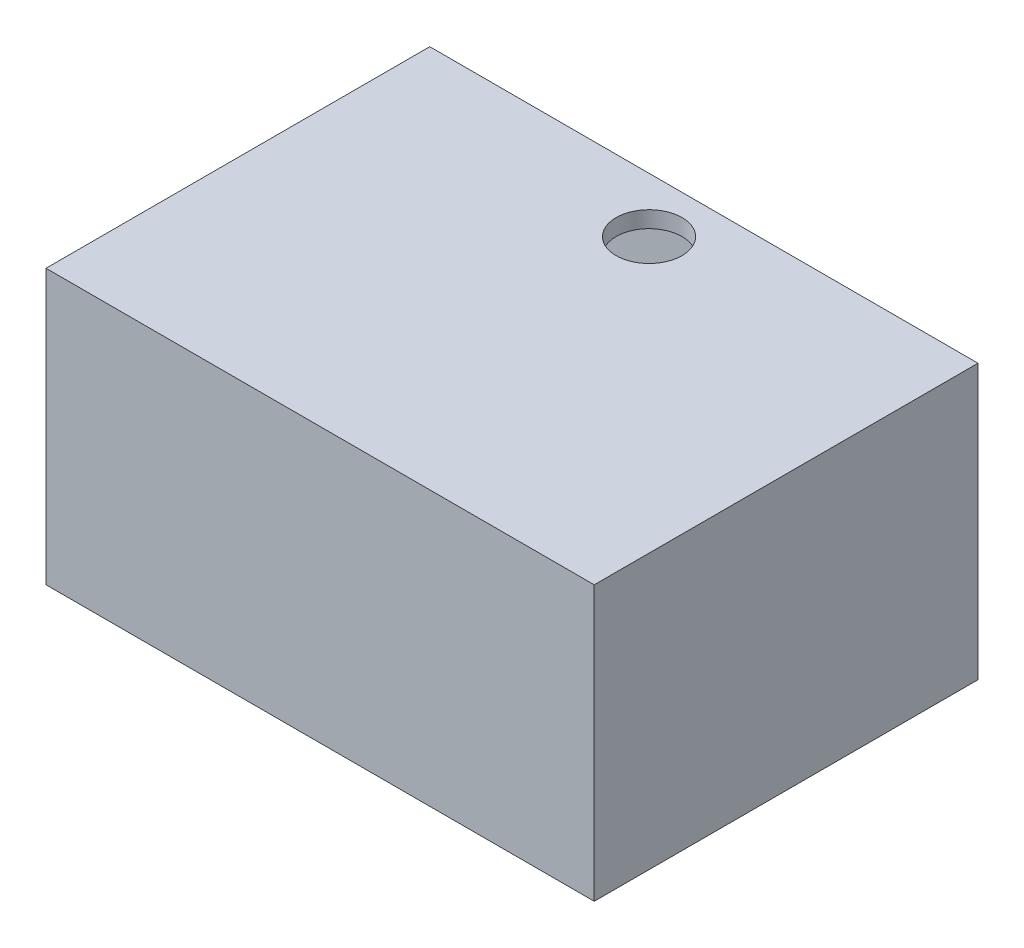
ISO-10303-21;
HEADER;
FILE_DESCRIPTION(('STEP AP214'),'2;1');
FILE_NAME('part.step','',(''),(''),'','','');
FILE_SCHEMA(('AUTOMOTIVE_DESIGN { 1 0 10303 214 1 1 1 1 }'));
ENDSEC;
DATA;
#1=APPLICATION_CONTEXT('core data for automotive mechanical design processes');
#2=APPLICATION_PROTOCOL_DEFINITION('international standard','automotive_design',2000,#1);
#3=PRODUCT_CONTEXT('',#1,'mechanical');
#4=PRODUCT('Part','Part','',(#3));
#5=PRODUCT_RELATED_PRODUCT_CATEGORY('part','',(#4));
#6=PRODUCT_DEFINITION_FORMATION('','',#4);
#7=PRODUCT_DEFINITION_CONTEXT('part definition',#1,'design');
#8=PRODUCT_DEFINITION('design','',#6,#7);
#9=PRODUCT_DEFINITION_SHAPE('','',#8);
#10=(LENGTH_UNIT() NAMED_UNIT(*) SI_UNIT(.MILLI.,.METRE.));
#11=(NAMED_UNIT(*) PLANE_ANGLE_UNIT() SI_UNIT($,.RADIAN.));
#12=(NAMED_UNIT(*) SI_UNIT($,.STERADIAN.) SOLID_ANGLE_UNIT());
#13=UNCERTAINTY_MEASURE_WITH_UNIT(LENGTH_MEASURE(1.E-05),#10,'distance_accuracy_value','');
#14=(GEOMETRIC_REPRESENTATION_CONTEXT(3) GLOBAL_UNCERTAINTY_ASSIGNED_CONTEXT((#13)) GLOBAL_UNIT_ASSIGNED_CONTEXT((#10,
#11,#12)) REPRESENTATION_CONTEXT('',''));
#15=CARTESIAN_POINT('',(0.,0.,0.));
#16=DIRECTION('',(0.,0.,1.));
#17=DIRECTION('',(1.,0.,0.));
#18=AXIS2_PLACEMENT_3D('',#15,#16,#17);
#19=CARTESIAN_POINT('',(-50.,-22.,-70.));
#20=DIRECTION('',(0.,1.,0.));
#21=DIRECTION('',(0.,0.,-1.));
#22=AXIS2_PLACEMENT_3D('',#19,#20,#21);
#23=PLANE('',#22);
#24=DIRECTION('',(1.,0.,0.));
#25=VECTOR('',#24,1.);
#26=CARTESIAN_POINT('',(-50.,-22.,-3.));
#27=LINE('',#26,#25);
#28=CARTESIAN_POINT('',(-47.,-22.,-3.));
#29=VERTEX_POINT('',#28);
#30=CARTESIAN_POINT('',(47.,-22.,-3.));
#31=VERTEX_POINT('',#30);
#32=EDGE_CURVE('E139',#29,#31,#27,.T.);
#33=ORIENTED_EDGE('',*,*,#32,.T.);
#34=DIRECTION('',(0.,0.,1.));
#35=VECTOR('',#34,1.);
#36=CARTESIAN_POINT('',(47.,-22.,-70.));
#37=LINE('',#36,#35);
#38=CARTESIAN_POINT('',(47.,-22.,-67.));
#39=VERTEX_POINT('',#38);
#40=EDGE_CURVE('E140',#39,#31,#37,.T.);
#41=ORIENTED_EDGE('',*,*,#40,.F.);
#42=DIRECTION('',(1.,0.,0.));
#43=VECTOR('',#42,1.);
#44=CARTESIAN_POINT('',(-50.,-22.,-67.));
#45=LINE('',#44,#43);
#46=CARTESIAN_POINT('',(-47.,-22.,-67.));
#47=VERTEX_POINT('',#46);
#48=EDGE_CURVE('E124',#47,#39,#45,.T.);
#49=ORIENTED_EDGE('',*,*,#48,.F.);
#50=DIRECTION('',(0.,0.,1.));
#51=VECTOR('',#50,1.);
#52=CARTESIAN_POINT('',(-47.,-22.,-70.));
#53=LINE('',#52,#51);
#54=EDGE_CURVE('E120',#47,#29,#53,.T.);
#55=ORIENTED_EDGE('',*,*,#54,.T.);
#56=EDGE_LOOP('',(#33,#41,#49,#55));
#57=FACE_BOUND('',#56,.T.);
#58=ADVANCED_FACE('F37',(#57),#23,.T.);
#59=CARTESIAN_POINT('',(0.,0.,-67.));
#60=DIRECTION('',(0.,0.,-1.));
#61=DIRECTION('',(1.,0.,0.));
#62=AXIS2_PLACEMENT_3D('',#59,#60,#61);
#63=PLANE('',#62);
#64=CARTESIAN_POINT('',(-9.44,-11.95,-67.));
#65=DIRECTION('',(0.,0.,1.));
#66=DIRECTION('',(1.,0.,0.));
#67=AXIS2_PLACEMENT_3D('',#64,#65,#66);
#68=CIRCLE('',#67,7.5);
#69=CARTESIAN_POINT('',(-1.94,-11.95,-67.));
#70=VERTEX_POINT('',#69);
#71=EDGE_CURVE('E316',#70,#70,#68,.T.);
#72=ORIENTED_EDGE('',*,*,#71,.F.);
#73=EDGE_LOOP('',(#72));
#74=FACE_BOUND('',#73,.T.);
#75=DIRECTION('',(-1.,0.,0.));
#76=VECTOR('',#75,1.);
#77=CARTESIAN_POINT('',(50.,22.,-67.));
#78=LINE('',#77,#76);
#79=CARTESIAN_POINT('',(47.,22.,-67.));
#80=VERTEX_POINT('',#79);
#81=CARTESIAN_POINT('',(-47.,22.,-67.));
#82=VERTEX_POINT('',#81);
#83=EDGE_CURVE('E112',#80,#82,#78,.T.);
#84=ORIENTED_EDGE('',*,*,#83,.T.);
#85=DIRECTION('',(0.,-1.,0.));
#86=VECTOR('',#85,1.);
#87=CARTESIAN_POINT('',(-47.,25.,-67.));
#88=LINE('',#87,#86);
#89=EDGE_CURVE('E117',#82,#47,#88,.T.);
#90=ORIENTED_EDGE('',*,*,#89,.T.);
#91=ORIENTED_EDGE('',*,*,#48,.T.);
#92=DIRECTION('',(0.,1.,0.));
#93=VECTOR('',#92,1.);
#94=CARTESIAN_POINT('',(47.,25.,-67.));
#95=LINE('',#94,#93);
#96=EDGE_CURVE('E125',#39,#80,#95,.T.);
#97=ORIENTED_EDGE('',*,*,#96,.T.);
#98=EDGE_LOOP('',(#84,#90,#91,#97));
#99=FACE_BOUND('',#98,.T.);
#100=ADVANCED_FACE('F128',(#74,#99),#63,.F.);
#101=CARTESIAN_POINT('',(0.,0.,-3.));
#102=DIRECTION('',(0.,0.,-1.));
#103=DIRECTION('',(1.,0.,0.));
#104=AXIS2_PLACEMENT_3D('',#101,#102,#103);
#105=PLANE('',#104);
#106=DIRECTION('',(0.,1.,0.));
#107=VECTOR('',#106,1.);
#108=CARTESIAN_POINT('',(47.,25.,-3.));
#109=LINE('',#108,#107);
#110=CARTESIAN_POINT('',(47.,22.,-3.));
#111=VERTEX_POINT('',#110);
#112=EDGE_CURVE('E131',#31,#111,#109,.T.);
#113=ORIENTED_EDGE('',*,*,#112,.F.);
#114=ORIENTED_EDGE('',*,*,#32,.F.);
#115=DIRECTION('',(0.,-1.,0.));
#116=VECTOR('',#115,1.);
#117=CARTESIAN_POINT('',(-47.,25.,-3.));
#118=LINE('',#117,#116);
#119=CARTESIAN_POINT('',(-47.,22.,-3.));
#120=VERTEX_POINT('',#119);
#121=EDGE_CURVE('E137',#120,#29,#118,.T.);
#122=ORIENTED_EDGE('',*,*,#121,.F.);
#123=DIRECTION('',(-1.,0.,0.));
#124=VECTOR('',#123,1.);
#125=CARTESIAN_POINT('',(0.,22.,-3.));
#126=LINE('',#125,#124);
#127=EDGE_CURVE('E11',#111,#120,#126,.T.);
#128=ORIENTED_EDGE('',*,*,#127,.F.);
#129=EDGE_LOOP('',(#113,#114,#122,#128));
#130=FACE_BOUND('',#129,.T.);
#131=ADVANCED_FACE('F199',(#130),#105,.T.);
#132=CARTESIAN_POINT('',(-47.,25.,-70.));
#133=DIRECTION('',(1.,0.,0.));
#134=DIRECTION('',(0.,1.,0.));
#135=AXIS2_PLACEMENT_3D('',#132,#133,#134);
#136=PLANE('',#135);
#137=ORIENTED_EDGE('',*,*,#121,.T.);
#138=ORIENTED_EDGE('',*,*,#54,.F.);
#139=ORIENTED_EDGE('',*,*,#89,.F.);
#140=DIRECTION('',(0.,0.,1.));
#141=VECTOR('',#140,1.);
#142=CARTESIAN_POINT('',(-47.,22.,-67.));
#143=LINE('',#142,#141);
#144=EDGE_CURVE('E53',#82,#120,#143,.T.);
#145=ORIENTED_EDGE('',*,*,#144,.T.);
#146=EDGE_LOOP('',(#137,#138,#139,#145));
#147=FACE_BOUND('',#146,.T.);
#148=ADVANCED_FACE('F118',(#147),#136,.T.);
#149=CARTESIAN_POINT('',(47.,25.,-70.));
#150=DIRECTION('',(-1.,0.,0.));
#151=DIRECTION('',(0.,-1.,0.));
#152=AXIS2_PLACEMENT_3D('',#149,#150,#151);
#153=PLANE('',#152);
#154=ORIENTED_EDGE('',*,*,#96,.F.);
#155=ORIENTED_EDGE('',*,*,#40,.T.);
#156=ORIENTED_EDGE('',*,*,#112,.T.);
#157=DIRECTION('',(0.,0.,1.));
#158=VECTOR('',#157,1.);
#159=CARTESIAN_POINT('',(47.,22.,-70.));
#160=LINE('',#159,#158);
#161=EDGE_CURVE('E129',#80,#111,#160,.T.);
#162=ORIENTED_EDGE('',*,*,#161,.F.);
#163=EDGE_LOOP('',(#154,#155,#156,#162));
#164=FACE_BOUND('',#163,.T.);
#165=ADVANCED_FACE('F224',(#164),#153,.T.);
#166=CARTESIAN_POINT('',(50.,22.,-67.));
#167=DIRECTION('',(0.,1.,0.));
#168=DIRECTION('',(-1.,0.,0.));
#169=AXIS2_PLACEMENT_3D('',#166,#167,#168);
#170=PLANE('',#169);
#171=CARTESIAN_POINT('',(0.,22.,-60.));
#172=DIRECTION('',(0.,-1.,0.));
#173=DIRECTION('',(-1.,0.,0.));
#174=AXIS2_PLACEMENT_3D('',#171,#172,#173);
#175=CIRCLE('',#174,6.015);
#176=CARTESIAN_POINT('',(-6.015,22.,-60.));
#177=VERTEX_POINT('',#176);
#178=EDGE_CURVE('E41',#177,#177,#175,.T.);
#179=ORIENTED_EDGE('',*,*,#178,.F.);
#180=EDGE_LOOP('',(#179));
#181=FACE_BOUND('',#180,.T.);
#182=ORIENTED_EDGE('',*,*,#161,.T.);
#183=ORIENTED_EDGE('',*,*,#127,.T.);
#184=ORIENTED_EDGE('',*,*,#144,.F.);
#185=ORIENTED_EDGE('',*,*,#83,.F.);
#186=EDGE_LOOP('',(#182,#183,#184,#185));
#187=FACE_BOUND('',#186,.T.);
#188=ADVANCED_FACE('F110',(#181,#187),#170,.F.);
#189=CARTESIAN_POINT('',(0.,20.,-60.));
#190=DIRECTION('',(0.,1.,0.));
#191=DIRECTION('',(0.,0.,-1.));
#192=AXIS2_PLACEMENT_3D('',#189,#190,#191);
#193=CYLINDRICAL_SURFACE('',#192,6.015);
#194=CARTESIAN_POINT('',(0.,25.,-60.));
#195=DIRECTION('',(0.,-1.,0.));
#196=DIRECTION('',(0.,0.,-1.));
#197=AXIS2_PLACEMENT_3D('',#194,#195,#196);
#198=CIRCLE('',#197,6.015);
#199=CARTESIAN_POINT('',(0.,25.,-66.015));
#200=VERTEX_POINT('',#199);
#201=EDGE_CURVE('E315',#200,#200,#198,.T.);
#202=ORIENTED_EDGE('',*,*,#201,.F.);
#203=EDGE_LOOP('',(#202));
#204=FACE_BOUND('',#203,.T.);
#205=ORIENTED_EDGE('',*,*,#178,.T.);
#206=EDGE_LOOP('',(#205));
#207=FACE_BOUND('',#206,.T.);
#208=ADVANCED_FACE('F219',(#204,#207),#193,.F.);
#209=CARTESIAN_POINT('',(-50.,25.,-70.));
#210=DIRECTION('',(0.,-1.,0.));
#211=DIRECTION('',(0.,0.,1.));
#212=AXIS2_PLACEMENT_3D('',#209,#210,#211);
#213=PLANE('',#212);
#214=ORIENTED_EDGE('',*,*,#201,.T.);
#215=EDGE_LOOP('',(#214));
#216=FACE_BOUND('',#215,.T.);
#217=DIRECTION('',(0.,0.,1.));
#218=VECTOR('',#217,1.);
#219=CARTESIAN_POINT('',(50.,25.,-70.));
#220=LINE('',#219,#218);
#221=CARTESIAN_POINT('',(50.,25.,-70.));
#222=VERTEX_POINT('',#221);
#223=CARTESIAN_POINT('',(50.,25.,0.));
#224=VERTEX_POINT('',#223);
#225=EDGE_CURVE('E46',#222,#224,#220,.T.);
#226=ORIENTED_EDGE('',*,*,#225,.F.);
#227=DIRECTION('',(-1.,0.,0.));
#228=VECTOR('',#227,1.);
#229=CARTESIAN_POINT('',(-50.,25.,-70.));
#230=LINE('',#229,#228);
#231=CARTESIAN_POINT('',(-50.,25.,-70.));
#232=VERTEX_POINT('',#231);
#233=EDGE_CURVE('E150',#222,#232,#230,.T.);
#234=ORIENTED_EDGE('',*,*,#233,.T.);
#235=DIRECTION('',(0.,0.,1.));
#236=VECTOR('',#235,1.);
#237=CARTESIAN_POINT('',(-50.,25.,-70.));
#238=LINE('',#237,#236);
#239=CARTESIAN_POINT('',(-50.,25.,0.));
#240=VERTEX_POINT('',#239);
#241=EDGE_CURVE('E169',#232,#240,#238,.T.);
#242=ORIENTED_EDGE('',*,*,#241,.T.);
#243=DIRECTION('',(-1.,0.,0.));
#244=VECTOR('',#243,1.);
#245=CARTESIAN_POINT('',(-50.,25.,0.));
#246=LINE('',#245,#244);
#247=EDGE_CURVE('E159',#224,#240,#246,.T.);
#248=ORIENTED_EDGE('',*,*,#247,.F.);
#249=EDGE_LOOP('',(#226,#234,#242,#248));
#250=FACE_BOUND('',#249,.T.);
#251=ADVANCED_FACE('F176',(#216,#250),#213,.F.);
#252=CARTESIAN_POINT('',(50.,25.,-70.));
#253=DIRECTION('',(-1.,0.,0.));
#254=DIRECTION('',(0.,-1.,0.));
#255=AXIS2_PLACEMENT_3D('',#252,#253,#254);
#256=PLANE('',#255);
#257=DIRECTION('',(0.,1.,0.));
#258=VECTOR('',#257,1.);
#259=CARTESIAN_POINT('',(50.,25.,0.));
#260=LINE('',#259,#258);
#261=CARTESIAN_POINT('',(50.,-25.,0.));
#262=VERTEX_POINT('',#261);
#263=EDGE_CURVE('E147',#262,#224,#260,.T.);
#264=ORIENTED_EDGE('',*,*,#263,.F.);
#265=DIRECTION('',(0.,0.,1.));
#266=VECTOR('',#265,1.);
#267=CARTESIAN_POINT('',(50.,-25.,-70.));
#268=LINE('',#267,#266);
#269=CARTESIAN_POINT('',(50.,-25.,-70.));
#270=VERTEX_POINT('',#269);
#271=EDGE_CURVE('E157',#270,#262,#268,.T.);
#272=ORIENTED_EDGE('',*,*,#271,.F.);
#273=DIRECTION('',(0.,1.,0.));
#274=VECTOR('',#273,1.);
#275=CARTESIAN_POINT('',(50.,25.,-70.));
#276=LINE('',#275,#274);
#277=EDGE_CURVE('E87',#270,#222,#276,.T.);
#278=ORIENTED_EDGE('',*,*,#277,.T.);
#279=ORIENTED_EDGE('',*,*,#225,.T.);
#280=EDGE_LOOP('',(#264,#272,#278,#279));
#281=FACE_BOUND('',#280,.T.);
#282=ADVANCED_FACE('F39',(#281),#256,.F.);
#283=CARTESIAN_POINT('',(-50.,25.,-70.));
#284=DIRECTION('',(1.,0.,0.));
#285=DIRECTION('',(0.,1.,0.));
#286=AXIS2_PLACEMENT_3D('',#283,#284,#285);
#287=PLANE('',#286);
#288=DIRECTION('',(0.,-1.,0.));
#289=VECTOR('',#288,1.);
#290=CARTESIAN_POINT('',(-50.,25.,0.));
#291=LINE('',#290,#289);
#292=CARTESIAN_POINT('',(-50.,-25.,0.));
#293=VERTEX_POINT('',#292);
#294=EDGE_CURVE('E162',#240,#293,#291,.T.);
#295=ORIENTED_EDGE('',*,*,#294,.F.);
#296=ORIENTED_EDGE('',*,*,#241,.F.);
#297=DIRECTION('',(0.,-1.,0.));
#298=VECTOR('',#297,1.);
#299=CARTESIAN_POINT('',(-50.,25.,-70.));
#300=LINE('',#299,#298);
#301=CARTESIAN_POINT('',(-50.,-25.,-70.));
#302=VERTEX_POINT('',#301);
#303=EDGE_CURVE('E153',#232,#302,#300,.T.);
#304=ORIENTED_EDGE('',*,*,#303,.T.);
#305=DIRECTION('',(0.,0.,1.));
#306=VECTOR('',#305,1.);
#307=CARTESIAN_POINT('',(-50.,-25.,-70.));
#308=LINE('',#307,#306);
#309=EDGE_CURVE('E166',#302,#293,#308,.T.);
#310=ORIENTED_EDGE('',*,*,#309,.T.);
#311=EDGE_LOOP('',(#295,#296,#304,#310));
#312=FACE_BOUND('',#311,.T.);
#313=ADVANCED_FACE('F180',(#312),#287,.F.);
#314=CARTESIAN_POINT('',(-50.,-25.,-70.));
#315=DIRECTION('',(0.,1.,0.));
#316=DIRECTION('',(0.,0.,-1.));
#317=AXIS2_PLACEMENT_3D('',#314,#315,#316);
#318=PLANE('',#317);
#319=DIRECTION('',(1.,0.,0.));
#320=VECTOR('',#319,1.);
#321=CARTESIAN_POINT('',(-50.,-25.,0.));
#322=LINE('',#321,#320);
#323=EDGE_CURVE('E81',#293,#262,#322,.T.);
#324=ORIENTED_EDGE('',*,*,#323,.F.);
#325=ORIENTED_EDGE('',*,*,#309,.F.);
#326=DIRECTION('',(1.,0.,0.));
#327=VECTOR('',#326,1.);
#328=CARTESIAN_POINT('',(-50.,-25.,-70.));
#329=LINE('',#328,#327);
#330=EDGE_CURVE('E61',#302,#270,#329,.T.);
#331=ORIENTED_EDGE('',*,*,#330,.T.);
#332=ORIENTED_EDGE('',*,*,#271,.T.);
#333=EDGE_LOOP('',(#324,#325,#331,#332));
#334=FACE_BOUND('',#333,.T.);
#335=ADVANCED_FACE('F181',(#334),#318,.F.);
#336=CARTESIAN_POINT('',(0.,0.,-70.));
#337=DIRECTION('',(0.,0.,-1.));
#338=DIRECTION('',(1.,0.,0.));
#339=AXIS2_PLACEMENT_3D('',#336,#337,#338);
#340=PLANE('',#339);
#341=CARTESIAN_POINT('',(-9.44,-11.95,-70.));
#342=DIRECTION('',(0.,0.,1.));
#343=DIRECTION('',(1.,0.,0.));
#344=AXIS2_PLACEMENT_3D('',#341,#342,#343);
#345=CIRCLE('',#344,7.5);
#346=CARTESIAN_POINT('',(-1.94,-11.95,-70.));
#347=VERTEX_POINT('',#346);
#348=EDGE_CURVE('E319',#347,#347,#345,.T.);
#349=ORIENTED_EDGE('',*,*,#348,.T.);
#350=EDGE_LOOP('',(#349));
#351=FACE_BOUND('',#350,.T.);
#352=ORIENTED_EDGE('',*,*,#277,.F.);
#353=ORIENTED_EDGE('',*,*,#330,.F.);
#354=ORIENTED_EDGE('',*,*,#303,.F.);
#355=ORIENTED_EDGE('',*,*,#233,.F.);
#356=EDGE_LOOP('',(#352,#353,#354,#355));
#357=FACE_BOUND('',#356,.T.);
#358=ADVANCED_FACE('F183',(#351,#357),#340,.T.);
#359=CARTESIAN_POINT('',(0.,0.,0.));
#360=DIRECTION('',(0.,0.,-1.));
#361=DIRECTION('',(1.,0.,0.));
#362=AXIS2_PLACEMENT_3D('',#359,#360,#361);
#363=PLANE('',#362);
#364=ORIENTED_EDGE('',*,*,#263,.T.);
#365=ORIENTED_EDGE('',*,*,#247,.T.);
#366=ORIENTED_EDGE('',*,*,#294,.T.);
#367=ORIENTED_EDGE('',*,*,#323,.T.);
#368=EDGE_LOOP('',(#364,#365,#366,#367));
#369=FACE_BOUND('',#368,.T.);
#370=ADVANCED_FACE('F178',(#369),#363,.F.);
#371=CARTESIAN_POINT('',(-9.44,-11.95,-60.));
#372=DIRECTION('',(0.,0.,-1.));
#373=DIRECTION('',(1.,0.,0.));
#374=AXIS2_PLACEMENT_3D('',#371,#372,#373);
#375=CYLINDRICAL_SURFACE('',#374,7.5);
#376=ORIENTED_EDGE('',*,*,#348,.F.);
#377=EDGE_LOOP('',(#376));
#378=FACE_BOUND('',#377,.T.);
#379=ORIENTED_EDGE('',*,*,#71,.T.);
#380=EDGE_LOOP('',(#379));
#381=FACE_BOUND('',#380,.T.);
#382=ADVANCED_FACE('F208',(#378,#381),#375,.F.);
#383=CLOSED_SHELL('',(#58,#100,#131,#148,#165,#188,#208,#251,#282,#313,#335,#358,#370,#382));
#384=MANIFOLD_SOLID_BREP('B2',#383);
#385=ADVANCED_BREP_SHAPE_REPRESENTATION('',(#18,#384),#14);
#386=SHAPE_DEFINITION_REPRESENTATION(#9,#385);
ENDSEC;
END-ISO-10303-21;
